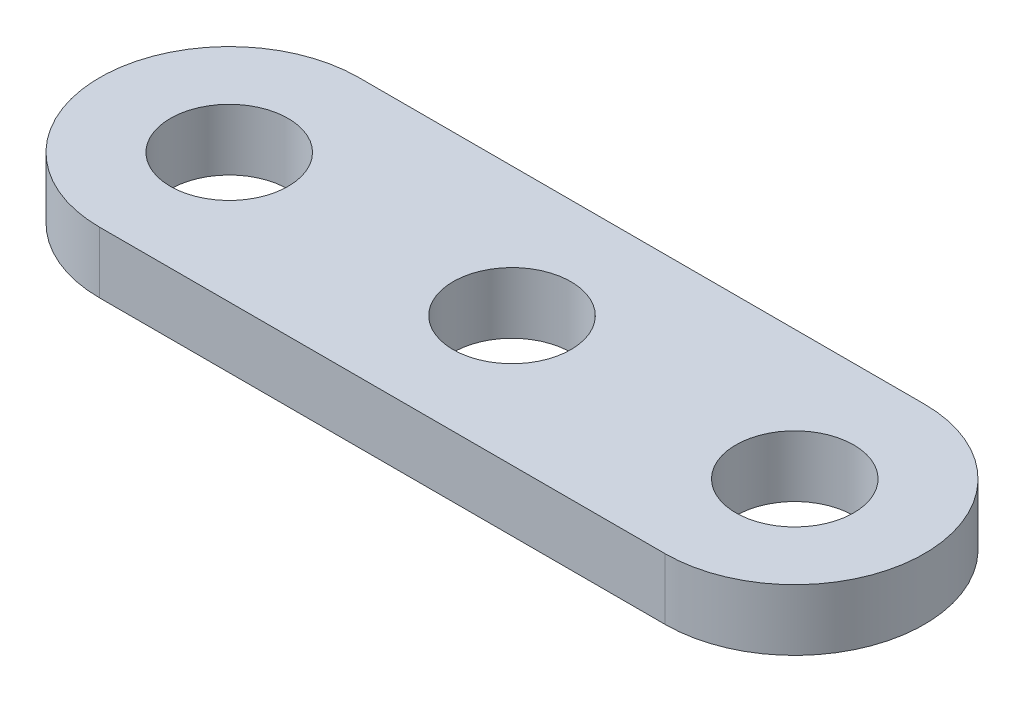
ISO-10303-21;
HEADER;
FILE_DESCRIPTION(('STEP AP214'),'2;1');
FILE_NAME('part.step','',(''),(''),'','','');
FILE_SCHEMA(('AUTOMOTIVE_DESIGN { 1 0 10303 214 1 1 1 1 }'));
ENDSEC;
DATA;
#1=APPLICATION_CONTEXT('core data for automotive mechanical design processes');
#2=APPLICATION_PROTOCOL_DEFINITION('international standard','automotive_design',2000,#1);
#3=PRODUCT_CONTEXT('',#1,'mechanical');
#4=PRODUCT('Part','Part','',(#3));
#5=PRODUCT_RELATED_PRODUCT_CATEGORY('part','',(#4));
#6=PRODUCT_DEFINITION_FORMATION('','',#4);
#7=PRODUCT_DEFINITION_CONTEXT('part definition',#1,'design');
#8=PRODUCT_DEFINITION('design','',#6,#7);
#9=PRODUCT_DEFINITION_SHAPE('','',#8);
#10=(LENGTH_UNIT() NAMED_UNIT(*) SI_UNIT(.MILLI.,.METRE.));
#11=(NAMED_UNIT(*) PLANE_ANGLE_UNIT() SI_UNIT($,.RADIAN.));
#12=(NAMED_UNIT(*) SI_UNIT($,.STERADIAN.) SOLID_ANGLE_UNIT());
#13=UNCERTAINTY_MEASURE_WITH_UNIT(LENGTH_MEASURE(1.E-05),#10,'distance_accuracy_value','');
#14=(GEOMETRIC_REPRESENTATION_CONTEXT(3) GLOBAL_UNCERTAINTY_ASSIGNED_CONTEXT((#13)) GLOBAL_UNIT_ASSIGNED_CONTEXT((#10,
#11,#12)) REPRESENTATION_CONTEXT('',''));
#15=CARTESIAN_POINT('',(0.,0.,0.));
#16=DIRECTION('',(0.,0.,1.));
#17=DIRECTION('',(1.,0.,0.));
#18=AXIS2_PLACEMENT_3D('',#15,#16,#17);
#19=CARTESIAN_POINT('',(-12.,2.6,0.));
#20=DIRECTION('',(0.,1.,0.));
#21=DIRECTION('',(0.,0.,1.));
#22=AXIS2_PLACEMENT_3D('',#19,#20,#21);
#23=PLANE('',#22);
#24=CARTESIAN_POINT('',(0.,2.6,0.));
#25=DIRECTION('',(0.,1.,0.));
#26=DIRECTION('',(0.,0.,1.));
#27=AXIS2_PLACEMENT_3D('',#24,#25,#26);
#28=CIRCLE('',#27,2.5);
#29=CARTESIAN_POINT('',(0.,2.6,2.5));
#30=VERTEX_POINT('',#29);
#31=EDGE_CURVE('E138',#30,#30,#28,.T.);
#32=ORIENTED_EDGE('',*,*,#31,.F.);
#33=EDGE_LOOP('',(#32));
#34=FACE_BOUND('',#33,.T.);
#35=CARTESIAN_POINT('',(-12.,2.6,0.));
#36=DIRECTION('',(0.,1.,0.));
#37=DIRECTION('',(0.,0.,1.));
#38=AXIS2_PLACEMENT_3D('',#35,#36,#37);
#39=CIRCLE('',#38,5.5);
#40=CARTESIAN_POINT('',(-12.,2.6,-5.5));
#41=VERTEX_POINT('',#40);
#42=CARTESIAN_POINT('',(-12.,2.6,5.5));
#43=VERTEX_POINT('',#42);
#44=EDGE_CURVE('E96',#41,#43,#39,.T.);
#45=ORIENTED_EDGE('',*,*,#44,.T.);
#46=DIRECTION('',(1.,0.,0.));
#47=VECTOR('',#46,1.);
#48=CARTESIAN_POINT('',(-12.,2.6,5.5));
#49=LINE('',#48,#47);
#50=CARTESIAN_POINT('',(12.,2.6,5.5));
#51=VERTEX_POINT('',#50);
#52=EDGE_CURVE('E91',#43,#51,#49,.T.);
#53=ORIENTED_EDGE('',*,*,#52,.T.);
#54=CARTESIAN_POINT('',(12.,2.6,0.));
#55=DIRECTION('',(0.,1.,0.));
#56=DIRECTION('',(0.,0.,1.));
#57=AXIS2_PLACEMENT_3D('',#54,#55,#56);
#58=CIRCLE('',#57,5.5);
#59=CARTESIAN_POINT('',(12.,2.6,-5.5));
#60=VERTEX_POINT('',#59);
#61=EDGE_CURVE('E94',#51,#60,#58,.T.);
#62=ORIENTED_EDGE('',*,*,#61,.T.);
#63=DIRECTION('',(-1.,0.,0.));
#64=VECTOR('',#63,1.);
#65=CARTESIAN_POINT('',(-12.,2.6,-5.5));
#66=LINE('',#65,#64);
#67=EDGE_CURVE('E61',#60,#41,#66,.T.);
#68=ORIENTED_EDGE('',*,*,#67,.T.);
#69=EDGE_LOOP('',(#45,#53,#62,#68));
#70=FACE_BOUND('',#69,.T.);
#71=CARTESIAN_POINT('',(-12.,2.6,0.));
#72=DIRECTION('',(0.,1.,0.));
#73=DIRECTION('',(0.,0.,1.));
#74=AXIS2_PLACEMENT_3D('',#71,#72,#73);
#75=CIRCLE('',#74,2.5);
#76=CARTESIAN_POINT('',(-12.,2.6,2.5));
#77=VERTEX_POINT('',#76);
#78=EDGE_CURVE('E116',#77,#77,#75,.T.);
#79=ORIENTED_EDGE('',*,*,#78,.F.);
#80=EDGE_LOOP('',(#79));
#81=FACE_BOUND('',#80,.T.);
#82=CARTESIAN_POINT('',(12.,2.6,0.));
#83=DIRECTION('',(0.,1.,0.));
#84=DIRECTION('',(0.,0.,-1.));
#85=AXIS2_PLACEMENT_3D('',#82,#83,#84);
#86=CIRCLE('',#85,2.5);
#87=CARTESIAN_POINT('',(12.,2.6,-2.5));
#88=VERTEX_POINT('',#87);
#89=EDGE_CURVE('E146',#88,#88,#86,.T.);
#90=ORIENTED_EDGE('',*,*,#89,.F.);
#91=EDGE_LOOP('',(#90));
#92=FACE_BOUND('',#91,.T.);
#93=ADVANCED_FACE('F43',(#34,#70,#81,#92),#23,.T.);
#94=CARTESIAN_POINT('',(-12.,0.,0.));
#95=DIRECTION('',(0.,1.,0.));
#96=DIRECTION('',(0.,0.,1.));
#97=AXIS2_PLACEMENT_3D('',#94,#95,#96);
#98=PLANE('',#97);
#99=CARTESIAN_POINT('',(-12.,0.,0.));
#100=DIRECTION('',(0.,1.,0.));
#101=DIRECTION('',(0.,0.,1.));
#102=AXIS2_PLACEMENT_3D('',#99,#100,#101);
#103=CIRCLE('',#102,5.5);
#104=CARTESIAN_POINT('',(-12.,0.,-5.5));
#105=VERTEX_POINT('',#104);
#106=CARTESIAN_POINT('',(-12.,0.,5.5));
#107=VERTEX_POINT('',#106);
#108=EDGE_CURVE('E112',#105,#107,#103,.T.);
#109=ORIENTED_EDGE('',*,*,#108,.F.);
#110=DIRECTION('',(-1.,0.,0.));
#111=VECTOR('',#110,1.);
#112=CARTESIAN_POINT('',(-12.,0.,-5.5));
#113=LINE('',#112,#111);
#114=CARTESIAN_POINT('',(12.,0.,-5.5));
#115=VERTEX_POINT('',#114);
#116=EDGE_CURVE('E84',#115,#105,#113,.T.);
#117=ORIENTED_EDGE('',*,*,#116,.F.);
#118=CARTESIAN_POINT('',(12.,0.,0.));
#119=DIRECTION('',(0.,1.,0.));
#120=DIRECTION('',(0.,0.,1.));
#121=AXIS2_PLACEMENT_3D('',#118,#119,#120);
#122=CIRCLE('',#121,5.5);
#123=CARTESIAN_POINT('',(12.,0.,5.5));
#124=VERTEX_POINT('',#123);
#125=EDGE_CURVE('E78',#124,#115,#122,.T.);
#126=ORIENTED_EDGE('',*,*,#125,.F.);
#127=DIRECTION('',(1.,0.,0.));
#128=VECTOR('',#127,1.);
#129=CARTESIAN_POINT('',(-12.,0.,5.5));
#130=LINE('',#129,#128);
#131=EDGE_CURVE('E101',#107,#124,#130,.T.);
#132=ORIENTED_EDGE('',*,*,#131,.F.);
#133=EDGE_LOOP('',(#109,#117,#126,#132));
#134=FACE_BOUND('',#133,.T.);
#135=CARTESIAN_POINT('',(-12.,0.,0.));
#136=DIRECTION('',(0.,1.,0.));
#137=DIRECTION('',(0.,0.,1.));
#138=AXIS2_PLACEMENT_3D('',#135,#136,#137);
#139=CIRCLE('',#138,2.5);
#140=CARTESIAN_POINT('',(-12.,0.,2.5));
#141=VERTEX_POINT('',#140);
#142=EDGE_CURVE('E134',#141,#141,#139,.T.);
#143=ORIENTED_EDGE('',*,*,#142,.T.);
#144=EDGE_LOOP('',(#143));
#145=FACE_BOUND('',#144,.T.);
#146=CARTESIAN_POINT('',(0.,0.,0.));
#147=DIRECTION('',(0.,1.,0.));
#148=DIRECTION('',(0.,0.,1.));
#149=AXIS2_PLACEMENT_3D('',#146,#147,#148);
#150=CIRCLE('',#149,2.5);
#151=CARTESIAN_POINT('',(0.,0.,2.5));
#152=VERTEX_POINT('',#151);
#153=EDGE_CURVE('E142',#152,#152,#150,.T.);
#154=ORIENTED_EDGE('',*,*,#153,.T.);
#155=EDGE_LOOP('',(#154));
#156=FACE_BOUND('',#155,.T.);
#157=CARTESIAN_POINT('',(12.,0.,0.));
#158=DIRECTION('',(0.,1.,0.));
#159=DIRECTION('',(0.,0.,-1.));
#160=AXIS2_PLACEMENT_3D('',#157,#158,#159);
#161=CIRCLE('',#160,2.5);
#162=CARTESIAN_POINT('',(12.,0.,-2.5));
#163=VERTEX_POINT('',#162);
#164=EDGE_CURVE('E150',#163,#163,#161,.T.);
#165=ORIENTED_EDGE('',*,*,#164,.T.);
#166=EDGE_LOOP('',(#165));
#167=FACE_BOUND('',#166,.T.);
#168=ADVANCED_FACE('F129',(#134,#145,#156,#167),#98,.F.);
#169=CARTESIAN_POINT('',(-12.,2.6,0.));
#170=DIRECTION('',(0.,-1.,0.));
#171=DIRECTION('',(0.,0.,-1.));
#172=AXIS2_PLACEMENT_3D('',#169,#170,#171);
#173=CYLINDRICAL_SURFACE('',#172,5.5);
#174=ORIENTED_EDGE('',*,*,#108,.T.);
#175=DIRECTION('',(0.,-1.,0.));
#176=VECTOR('',#175,1.);
#177=CARTESIAN_POINT('',(-12.,2.6,5.5));
#178=LINE('',#177,#176);
#179=EDGE_CURVE('E11',#43,#107,#178,.T.);
#180=ORIENTED_EDGE('',*,*,#179,.F.);
#181=ORIENTED_EDGE('',*,*,#44,.F.);
#182=DIRECTION('',(0.,-1.,0.));
#183=VECTOR('',#182,1.);
#184=CARTESIAN_POINT('',(-12.,2.6,-5.5));
#185=LINE('',#184,#183);
#186=EDGE_CURVE('E108',#41,#105,#185,.T.);
#187=ORIENTED_EDGE('',*,*,#186,.T.);
#188=EDGE_LOOP('',(#174,#180,#181,#187));
#189=FACE_BOUND('',#188,.T.);
#190=ADVANCED_FACE('F45',(#189),#173,.T.);
#191=CARTESIAN_POINT('',(-12.,2.6,5.5));
#192=DIRECTION('',(0.,0.,-1.));
#193=DIRECTION('',(-1.,0.,0.));
#194=AXIS2_PLACEMENT_3D('',#191,#192,#193);
#195=PLANE('',#194);
#196=ORIENTED_EDGE('',*,*,#131,.T.);
#197=DIRECTION('',(0.,-1.,0.));
#198=VECTOR('',#197,1.);
#199=CARTESIAN_POINT('',(12.,2.6,5.5));
#200=LINE('',#199,#198);
#201=EDGE_CURVE('E53',#51,#124,#200,.T.);
#202=ORIENTED_EDGE('',*,*,#201,.F.);
#203=ORIENTED_EDGE('',*,*,#52,.F.);
#204=ORIENTED_EDGE('',*,*,#179,.T.);
#205=EDGE_LOOP('',(#196,#202,#203,#204));
#206=FACE_BOUND('',#205,.T.);
#207=ADVANCED_FACE('F100',(#206),#195,.F.);
#208=CARTESIAN_POINT('',(12.,2.6,0.));
#209=DIRECTION('',(0.,-1.,0.));
#210=DIRECTION('',(0.,0.,-1.));
#211=AXIS2_PLACEMENT_3D('',#208,#209,#210);
#212=CYLINDRICAL_SURFACE('',#211,5.5);
#213=ORIENTED_EDGE('',*,*,#125,.T.);
#214=DIRECTION('',(0.,-1.,0.));
#215=VECTOR('',#214,1.);
#216=CARTESIAN_POINT('',(12.,2.6,-5.5));
#217=LINE('',#216,#215);
#218=EDGE_CURVE('E103',#60,#115,#217,.T.);
#219=ORIENTED_EDGE('',*,*,#218,.F.);
#220=ORIENTED_EDGE('',*,*,#61,.F.);
#221=ORIENTED_EDGE('',*,*,#201,.T.);
#222=EDGE_LOOP('',(#213,#219,#220,#221));
#223=FACE_BOUND('',#222,.T.);
#224=ADVANCED_FACE('F104',(#223),#212,.T.);
#225=CARTESIAN_POINT('',(-12.,2.6,-5.5));
#226=DIRECTION('',(0.,0.,1.));
#227=DIRECTION('',(1.,0.,0.));
#228=AXIS2_PLACEMENT_3D('',#225,#226,#227);
#229=PLANE('',#228);
#230=ORIENTED_EDGE('',*,*,#116,.T.);
#231=ORIENTED_EDGE('',*,*,#186,.F.);
#232=ORIENTED_EDGE('',*,*,#67,.F.);
#233=ORIENTED_EDGE('',*,*,#218,.T.);
#234=EDGE_LOOP('',(#230,#231,#232,#233));
#235=FACE_BOUND('',#234,.T.);
#236=ADVANCED_FACE('F126',(#235),#229,.F.);
#237=CARTESIAN_POINT('',(-12.,2.6,0.));
#238=DIRECTION('',(0.,-1.,0.));
#239=DIRECTION('',(0.,0.,-1.));
#240=AXIS2_PLACEMENT_3D('',#237,#238,#239);
#241=CYLINDRICAL_SURFACE('',#240,2.5);
#242=ORIENTED_EDGE('',*,*,#78,.T.);
#243=EDGE_LOOP('',(#242));
#244=FACE_BOUND('',#243,.T.);
#245=ORIENTED_EDGE('',*,*,#142,.F.);
#246=EDGE_LOOP('',(#245));
#247=FACE_BOUND('',#246,.T.);
#248=ADVANCED_FACE('F170',(#244,#247),#241,.F.);
#249=CARTESIAN_POINT('',(0.,2.6,0.));
#250=DIRECTION('',(0.,-1.,0.));
#251=DIRECTION('',(0.,0.,-1.));
#252=AXIS2_PLACEMENT_3D('',#249,#250,#251);
#253=CYLINDRICAL_SURFACE('',#252,2.5);
#254=ORIENTED_EDGE('',*,*,#31,.T.);
#255=EDGE_LOOP('',(#254));
#256=FACE_BOUND('',#255,.T.);
#257=ORIENTED_EDGE('',*,*,#153,.F.);
#258=EDGE_LOOP('',(#257));
#259=FACE_BOUND('',#258,.T.);
#260=ADVANCED_FACE('F224',(#256,#259),#253,.F.);
#261=CARTESIAN_POINT('',(12.,2.6,0.));
#262=DIRECTION('',(0.,-1.,0.));
#263=DIRECTION('',(0.,0.,-1.));
#264=AXIS2_PLACEMENT_3D('',#261,#262,#263);
#265=CYLINDRICAL_SURFACE('',#264,2.5);
#266=ORIENTED_EDGE('',*,*,#89,.T.);
#267=EDGE_LOOP('',(#266));
#268=FACE_BOUND('',#267,.T.);
#269=ORIENTED_EDGE('',*,*,#164,.F.);
#270=EDGE_LOOP('',(#269));
#271=FACE_BOUND('',#270,.T.);
#272=ADVANCED_FACE('F158',(#268,#271),#265,.F.);
#273=CLOSED_SHELL('',(#93,#168,#190,#207,#224,#236,#248,#260,#272));
#274=MANIFOLD_SOLID_BREP('B2',#273);
#275=ADVANCED_BREP_SHAPE_REPRESENTATION('',(#18,#274),#14);
#276=SHAPE_DEFINITION_REPRESENTATION(#9,#275);
ENDSEC;
END-ISO-10303-21;
